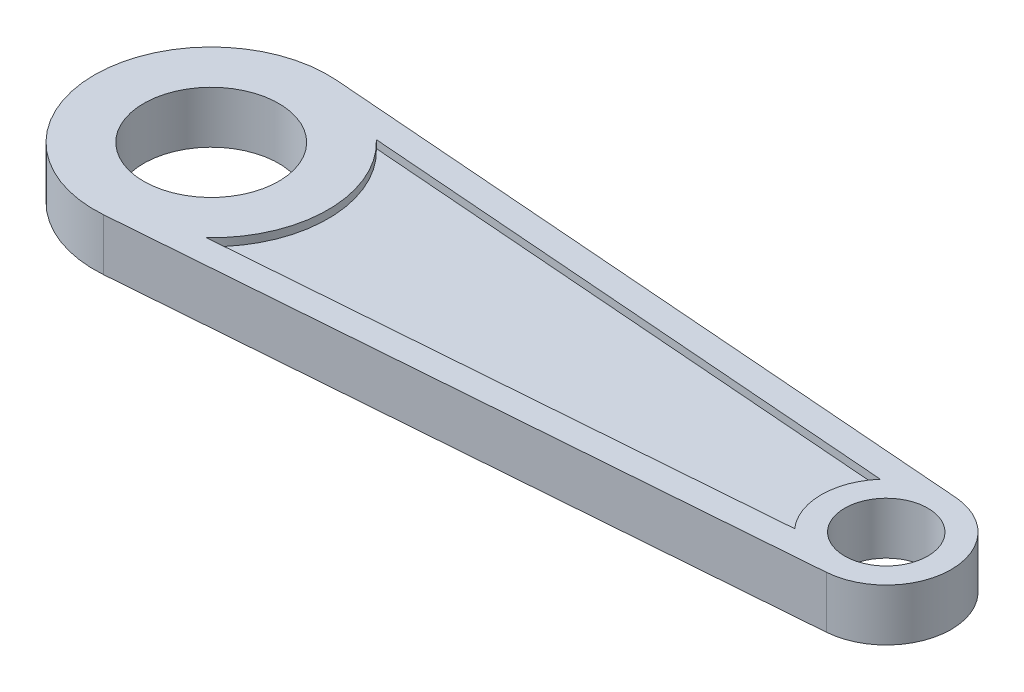
ISO-10303-21;
HEADER;
FILE_DESCRIPTION(('STEP AP214'),'2;1');
FILE_NAME('part.step','',(''),(''),'','','');
FILE_SCHEMA(('AUTOMOTIVE_DESIGN { 1 0 10303 214 1 1 1 1 }'));
ENDSEC;
DATA;
#1=APPLICATION_CONTEXT('core data for automotive mechanical design processes');
#2=APPLICATION_PROTOCOL_DEFINITION('international standard','automotive_design',2000,#1);
#3=PRODUCT_CONTEXT('',#1,'mechanical');
#4=PRODUCT('Part','Part','',(#3));
#5=PRODUCT_RELATED_PRODUCT_CATEGORY('part','',(#4));
#6=PRODUCT_DEFINITION_FORMATION('','',#4);
#7=PRODUCT_DEFINITION_CONTEXT('part definition',#1,'design');
#8=PRODUCT_DEFINITION('design','',#6,#7);
#9=PRODUCT_DEFINITION_SHAPE('','',#8);
#10=(LENGTH_UNIT() NAMED_UNIT(*) SI_UNIT(.MILLI.,.METRE.));
#11=(NAMED_UNIT(*) PLANE_ANGLE_UNIT() SI_UNIT($,.RADIAN.));
#12=(NAMED_UNIT(*) SI_UNIT($,.STERADIAN.) SOLID_ANGLE_UNIT());
#13=UNCERTAINTY_MEASURE_WITH_UNIT(LENGTH_MEASURE(1.E-05),#10,'distance_accuracy_value','');
#14=(GEOMETRIC_REPRESENTATION_CONTEXT(3) GLOBAL_UNCERTAINTY_ASSIGNED_CONTEXT((#13)) GLOBAL_UNIT_ASSIGNED_CONTEXT((#10,
#11,#12)) REPRESENTATION_CONTEXT('',''));
#15=CARTESIAN_POINT('',(0.,0.,0.));
#16=DIRECTION('',(0.,0.,1.));
#17=DIRECTION('',(1.,0.,0.));
#18=AXIS2_PLACEMENT_3D('',#15,#16,#17);
#19=CARTESIAN_POINT('',(130.,10.,0.));
#20=DIRECTION('',(0.,-1.,0.));
#21=DIRECTION('',(0.,0.,-1.));
#22=AXIS2_PLACEMENT_3D('',#19,#20,#21);
#23=CYLINDRICAL_SURFACE('',#22,12.5);
#24=CARTESIAN_POINT('',(130.,0.,0.));
#25=DIRECTION('',(0.,1.,0.));
#26=DIRECTION('',(0.,0.,1.));
#27=AXIS2_PLACEMENT_3D('',#24,#25,#26);
#28=CIRCLE('',#27,12.5);
#29=CARTESIAN_POINT('',(130.961538461538,0.,12.4629628815536));
#30=VERTEX_POINT('',#29);
#31=CARTESIAN_POINT('',(130.961538461538,0.,-12.4629628815536));
#32=VERTEX_POINT('',#31);
#33=EDGE_CURVE('E211',#30,#32,#28,.T.);
#34=ORIENTED_EDGE('',*,*,#33,.T.);
#35=DIRECTION('',(0.,-1.,0.));
#36=VECTOR('',#35,1.);
#37=CARTESIAN_POINT('',(130.961538461538,10.,-12.4629628815536));
#38=LINE('',#37,#36);
#39=CARTESIAN_POINT('',(130.961538461538,10.,-12.4629628815536));
#40=VERTEX_POINT('',#39);
#41=EDGE_CURVE('E11',#40,#32,#38,.T.);
#42=ORIENTED_EDGE('',*,*,#41,.F.);
#43=CARTESIAN_POINT('',(130.,10.,0.));
#44=DIRECTION('',(0.,1.,0.));
#45=DIRECTION('',(0.,0.,1.));
#46=AXIS2_PLACEMENT_3D('',#43,#44,#45);
#47=CIRCLE('',#46,12.5);
#48=CARTESIAN_POINT('',(130.961538461538,10.,12.4629628815536));
#49=VERTEX_POINT('',#48);
#50=EDGE_CURVE('E220',#49,#40,#47,.T.);
#51=ORIENTED_EDGE('',*,*,#50,.F.);
#52=DIRECTION('',(0.,-1.,0.));
#53=VECTOR('',#52,1.);
#54=CARTESIAN_POINT('',(130.961538461538,10.,12.4629628815536));
#55=LINE('',#54,#53);
#56=EDGE_CURVE('E242',#49,#30,#55,.T.);
#57=ORIENTED_EDGE('',*,*,#56,.T.);
#58=EDGE_LOOP('',(#34,#42,#51,#57));
#59=FACE_BOUND('',#58,.T.);
#60=ADVANCED_FACE('F39',(#59),#23,.T.);
#61=CARTESIAN_POINT('',(1.73076923076923,10.,-22.4333331867964));
#62=DIRECTION('',(0.076923076923077,0.,-0.997037030524286));
#63=DIRECTION('',(-0.997037030524286,0.,-0.076923076923077));
#64=AXIS2_PLACEMENT_3D('',#61,#62,#63);
#65=PLANE('',#64);
#66=DIRECTION('',(0.997037030524286,0.,0.076923076923077));
#67=VECTOR('',#66,1.);
#68=CARTESIAN_POINT('',(1.73076923076923,0.,-22.4333331867964));
#69=LINE('',#68,#67);
#70=CARTESIAN_POINT('',(1.73076923076923,0.,-22.4333331867964));
#71=VERTEX_POINT('',#70);
#72=EDGE_CURVE('E246',#71,#32,#69,.T.);
#73=ORIENTED_EDGE('',*,*,#72,.F.);
#74=DIRECTION('',(0.,-1.,0.));
#75=VECTOR('',#74,1.);
#76=CARTESIAN_POINT('',(1.73076923076923,10.,-22.4333331867964));
#77=LINE('',#76,#75);
#78=CARTESIAN_POINT('',(1.73076923076923,10.,-22.4333331867964));
#79=VERTEX_POINT('',#78);
#80=EDGE_CURVE('E47',#79,#71,#77,.T.);
#81=ORIENTED_EDGE('',*,*,#80,.F.);
#82=DIRECTION('',(0.997037030524286,0.,0.076923076923077));
#83=VECTOR('',#82,1.);
#84=CARTESIAN_POINT('',(1.73076923076923,10.,-22.4333331867964));
#85=LINE('',#84,#83);
#86=EDGE_CURVE('E223',#79,#40,#85,.T.);
#87=ORIENTED_EDGE('',*,*,#86,.T.);
#88=ORIENTED_EDGE('',*,*,#41,.T.);
#89=EDGE_LOOP('',(#73,#81,#87,#88));
#90=FACE_BOUND('',#89,.T.);
#91=ADVANCED_FACE('F283',(#90),#65,.T.);
#92=CARTESIAN_POINT('',(0.,10.,0.));
#93=DIRECTION('',(0.,-1.,0.));
#94=DIRECTION('',(0.,0.,-1.));
#95=AXIS2_PLACEMENT_3D('',#92,#93,#94);
#96=CYLINDRICAL_SURFACE('',#95,22.5);
#97=CARTESIAN_POINT('',(0.,0.,0.));
#98=DIRECTION('',(0.,1.,0.));
#99=DIRECTION('',(0.,0.,1.));
#100=AXIS2_PLACEMENT_3D('',#97,#98,#99);
#101=CIRCLE('',#100,22.5);
#102=CARTESIAN_POINT('',(1.73076923076923,0.,22.4333331867964));
#103=VERTEX_POINT('',#102);
#104=EDGE_CURVE('E250',#71,#103,#101,.T.);
#105=ORIENTED_EDGE('',*,*,#104,.T.);
#106=DIRECTION('',(0.,-1.,0.));
#107=VECTOR('',#106,1.);
#108=CARTESIAN_POINT('',(1.73076923076923,10.,22.4333331867964));
#109=LINE('',#108,#107);
#110=CARTESIAN_POINT('',(1.73076923076923,10.,22.4333331867964));
#111=VERTEX_POINT('',#110);
#112=EDGE_CURVE('E266',#111,#103,#109,.T.);
#113=ORIENTED_EDGE('',*,*,#112,.F.);
#114=CARTESIAN_POINT('',(0.,10.,0.));
#115=DIRECTION('',(0.,1.,0.));
#116=DIRECTION('',(0.,0.,1.));
#117=AXIS2_PLACEMENT_3D('',#114,#115,#116);
#118=CIRCLE('',#117,22.5);
#119=EDGE_CURVE('E228',#79,#111,#118,.T.);
#120=ORIENTED_EDGE('',*,*,#119,.F.);
#121=ORIENTED_EDGE('',*,*,#80,.T.);
#122=EDGE_LOOP('',(#105,#113,#120,#121));
#123=FACE_BOUND('',#122,.T.);
#124=ADVANCED_FACE('F273',(#123),#96,.T.);
#125=CARTESIAN_POINT('',(0.,10.,0.));
#126=DIRECTION('',(0.,-1.,0.));
#127=DIRECTION('',(0.,0.,-1.));
#128=AXIS2_PLACEMENT_3D('',#125,#126,#127);
#129=CYLINDRICAL_SURFACE('',#128,13.);
#130=CARTESIAN_POINT('',(0.,10.,0.));
#131=DIRECTION('',(0.,1.,0.));
#132=DIRECTION('',(0.,0.,1.));
#133=AXIS2_PLACEMENT_3D('',#130,#131,#132);
#134=CIRCLE('',#133,13.);
#135=CARTESIAN_POINT('',(0.,10.,13.));
#136=VERTEX_POINT('',#135);
#137=EDGE_CURVE('E234',#136,#136,#134,.T.);
#138=ORIENTED_EDGE('',*,*,#137,.T.);
#139=EDGE_LOOP('',(#138));
#140=FACE_BOUND('',#139,.T.);
#141=CARTESIAN_POINT('',(0.,0.,0.));
#142=DIRECTION('',(0.,1.,0.));
#143=DIRECTION('',(0.,0.,1.));
#144=AXIS2_PLACEMENT_3D('',#141,#142,#143);
#145=CIRCLE('',#144,13.);
#146=CARTESIAN_POINT('',(0.,0.,13.));
#147=VERTEX_POINT('',#146);
#148=EDGE_CURVE('E256',#147,#147,#145,.T.);
#149=ORIENTED_EDGE('',*,*,#148,.F.);
#150=EDGE_LOOP('',(#149));
#151=FACE_BOUND('',#150,.T.);
#152=ADVANCED_FACE('F323',(#140,#151),#129,.F.);
#153=CARTESIAN_POINT('',(1.73076923076923,10.,22.4333331867964));
#154=DIRECTION('',(-0.076923076923077,0.,-0.997037030524286));
#155=DIRECTION('',(-0.997037030524286,0.,0.076923076923077));
#156=AXIS2_PLACEMENT_3D('',#153,#154,#155);
#157=PLANE('',#156);
#158=DIRECTION('',(0.997037030524286,0.,-0.076923076923077));
#159=VECTOR('',#158,1.);
#160=CARTESIAN_POINT('',(1.73076923076923,0.,22.4333331867964));
#161=LINE('',#160,#159);
#162=EDGE_CURVE('E253',#103,#30,#161,.T.);
#163=ORIENTED_EDGE('',*,*,#162,.T.);
#164=ORIENTED_EDGE('',*,*,#56,.F.);
#165=DIRECTION('',(0.997037030524286,0.,-0.076923076923077));
#166=VECTOR('',#165,1.);
#167=CARTESIAN_POINT('',(1.73076923076923,10.,22.4333331867964));
#168=LINE('',#167,#166);
#169=EDGE_CURVE('E231',#111,#49,#168,.T.);
#170=ORIENTED_EDGE('',*,*,#169,.F.);
#171=ORIENTED_EDGE('',*,*,#112,.T.);
#172=EDGE_LOOP('',(#163,#164,#170,#171));
#173=FACE_BOUND('',#172,.T.);
#174=ADVANCED_FACE('F290',(#173),#157,.F.);
#175=CARTESIAN_POINT('',(130.,10.,0.));
#176=DIRECTION('',(0.,-1.,0.));
#177=DIRECTION('',(0.,0.,-1.));
#178=AXIS2_PLACEMENT_3D('',#175,#176,#177);
#179=CYLINDRICAL_SURFACE('',#178,8.00000000000001);
#180=CARTESIAN_POINT('',(130.,10.,0.));
#181=DIRECTION('',(0.,1.,0.));
#182=DIRECTION('',(0.,0.,1.));
#183=AXIS2_PLACEMENT_3D('',#180,#181,#182);
#184=CIRCLE('',#183,8.00000000000001);
#185=CARTESIAN_POINT('',(130.,10.,8.00000000000001));
#186=VERTEX_POINT('',#185);
#187=EDGE_CURVE('E238',#186,#186,#184,.T.);
#188=ORIENTED_EDGE('',*,*,#187,.T.);
#189=EDGE_LOOP('',(#188));
#190=FACE_BOUND('',#189,.T.);
#191=CARTESIAN_POINT('',(130.,0.,0.));
#192=DIRECTION('',(0.,1.,0.));
#193=DIRECTION('',(0.,0.,1.));
#194=AXIS2_PLACEMENT_3D('',#191,#192,#193);
#195=CIRCLE('',#194,8.00000000000001);
#196=CARTESIAN_POINT('',(130.,0.,8.00000000000001));
#197=VERTEX_POINT('',#196);
#198=EDGE_CURVE('E224',#197,#197,#195,.T.);
#199=ORIENTED_EDGE('',*,*,#198,.F.);
#200=EDGE_LOOP('',(#199));
#201=FACE_BOUND('',#200,.T.);
#202=ADVANCED_FACE('F295',(#190,#201),#179,.F.);
#203=CARTESIAN_POINT('',(0.,10.,0.));
#204=DIRECTION('',(0.,1.,0.));
#205=DIRECTION('',(0.,0.,1.));
#206=AXIS2_PLACEMENT_3D('',#203,#204,#205);
#207=PLANE('',#206);
#208=CARTESIAN_POINT('',(0.,10.,0.));
#209=DIRECTION('',(0.,-1.,0.));
#210=DIRECTION('',(0.,0.,1.));
#211=AXIS2_PLACEMENT_3D('',#208,#209,#210);
#212=CIRCLE('',#211,22.5);
#213=CARTESIAN_POINT('',(15.4463867537103,10.,-16.3602914477342));
#214=VERTEX_POINT('',#213);
#215=CARTESIAN_POINT('',(15.4463867537103,10.,16.3602914477342));
#216=VERTEX_POINT('',#215);
#217=EDGE_CURVE('E62',#214,#216,#212,.T.);
#218=ORIENTED_EDGE('',*,*,#217,.F.);
#219=DIRECTION('',(-0.997037030524286,0.,-0.0769230769230769));
#220=VECTOR('',#219,1.);
#221=CARTESIAN_POINT('',(15.4463867537103,10.,-16.3602914477342));
#222=LINE('',#221,#220);
#223=CARTESIAN_POINT('',(120.60655277168,10.,-8.24700849816292));
#224=VERTEX_POINT('',#223);
#225=EDGE_CURVE('E182',#224,#214,#222,.T.);
#226=ORIENTED_EDGE('',*,*,#225,.F.);
#227=CARTESIAN_POINT('',(130.,10.,0.));
#228=DIRECTION('',(0.,-1.,0.));
#229=DIRECTION('',(0.,0.,1.));
#230=AXIS2_PLACEMENT_3D('',#227,#228,#229);
#231=CIRCLE('',#230,12.5);
#232=CARTESIAN_POINT('',(120.60655277168,10.,8.24700849816291));
#233=VERTEX_POINT('',#232);
#234=EDGE_CURVE('E201',#233,#224,#231,.T.);
#235=ORIENTED_EDGE('',*,*,#234,.F.);
#236=DIRECTION('',(0.997037030524286,0.,-0.0769230769230769));
#237=VECTOR('',#236,1.);
#238=CARTESIAN_POINT('',(15.4463867537103,10.,16.3602914477342));
#239=LINE('',#238,#237);
#240=EDGE_CURVE('E197',#216,#233,#239,.T.);
#241=ORIENTED_EDGE('',*,*,#240,.F.);
#242=EDGE_LOOP('',(#218,#226,#235,#241));
#243=FACE_BOUND('',#242,.T.);
#244=ORIENTED_EDGE('',*,*,#50,.T.);
#245=ORIENTED_EDGE('',*,*,#86,.F.);
#246=ORIENTED_EDGE('',*,*,#119,.T.);
#247=ORIENTED_EDGE('',*,*,#169,.T.);
#248=EDGE_LOOP('',(#244,#245,#246,#247));
#249=FACE_BOUND('',#248,.T.);
#250=ORIENTED_EDGE('',*,*,#137,.F.);
#251=EDGE_LOOP('',(#250));
#252=FACE_BOUND('',#251,.T.);
#253=ORIENTED_EDGE('',*,*,#187,.F.);
#254=EDGE_LOOP('',(#253));
#255=FACE_BOUND('',#254,.T.);
#256=ADVANCED_FACE('F292',(#243,#249,#252,#255),#207,.T.);
#257=CARTESIAN_POINT('',(0.,0.,0.));
#258=DIRECTION('',(0.,1.,0.));
#259=DIRECTION('',(0.,0.,1.));
#260=AXIS2_PLACEMENT_3D('',#257,#258,#259);
#261=PLANE('',#260);
#262=DIRECTION('',(0.997037030524286,0.,0.0769230769230769));
#263=VECTOR('',#262,1.);
#264=CARTESIAN_POINT('',(15.4463867537103,0.,-16.3602914477342));
#265=LINE('',#264,#263);
#266=CARTESIAN_POINT('',(15.4463867537103,0.,-16.3602914477342));
#267=VERTEX_POINT('',#266);
#268=CARTESIAN_POINT('',(120.60655277168,0.,-8.24700849816291));
#269=VERTEX_POINT('',#268);
#270=EDGE_CURVE('E163',#267,#269,#265,.T.);
#271=ORIENTED_EDGE('',*,*,#270,.F.);
#272=CARTESIAN_POINT('',(0.,0.,0.));
#273=DIRECTION('',(0.,1.,0.));
#274=DIRECTION('',(0.,0.,-1.));
#275=AXIS2_PLACEMENT_3D('',#272,#273,#274);
#276=CIRCLE('',#275,22.5);
#277=CARTESIAN_POINT('',(15.4463867537103,0.,16.3602914477342));
#278=VERTEX_POINT('',#277);
#279=EDGE_CURVE('E54',#278,#267,#276,.T.);
#280=ORIENTED_EDGE('',*,*,#279,.F.);
#281=DIRECTION('',(-0.997037030524286,0.,0.0769230769230769));
#282=VECTOR('',#281,1.);
#283=CARTESIAN_POINT('',(15.4463867537103,0.,16.3602914477342));
#284=LINE('',#283,#282);
#285=CARTESIAN_POINT('',(120.60655277168,0.,8.24700849816292));
#286=VERTEX_POINT('',#285);
#287=EDGE_CURVE('E150',#286,#278,#284,.T.);
#288=ORIENTED_EDGE('',*,*,#287,.F.);
#289=CARTESIAN_POINT('',(130.,0.,0.));
#290=DIRECTION('',(0.,1.,0.));
#291=DIRECTION('',(0.,0.,-1.));
#292=AXIS2_PLACEMENT_3D('',#289,#290,#291);
#293=CIRCLE('',#292,12.5);
#294=EDGE_CURVE('E154',#269,#286,#293,.T.);
#295=ORIENTED_EDGE('',*,*,#294,.F.);
#296=EDGE_LOOP('',(#271,#280,#288,#295));
#297=FACE_BOUND('',#296,.T.);
#298=ORIENTED_EDGE('',*,*,#33,.F.);
#299=ORIENTED_EDGE('',*,*,#162,.F.);
#300=ORIENTED_EDGE('',*,*,#104,.F.);
#301=ORIENTED_EDGE('',*,*,#72,.T.);
#302=EDGE_LOOP('',(#298,#299,#300,#301));
#303=FACE_BOUND('',#302,.T.);
#304=ORIENTED_EDGE('',*,*,#148,.T.);
#305=EDGE_LOOP('',(#304));
#306=FACE_BOUND('',#305,.T.);
#307=ORIENTED_EDGE('',*,*,#198,.T.);
#308=EDGE_LOOP('',(#307));
#309=FACE_BOUND('',#308,.T.);
#310=ADVANCED_FACE('F281',(#297,#303,#306,#309),#261,.F.);
#311=CARTESIAN_POINT('',(0.,8.5,0.));
#312=DIRECTION('',(0.,1.,0.));
#313=DIRECTION('',(0.,0.,1.));
#314=AXIS2_PLACEMENT_3D('',#311,#312,#313);
#315=CYLINDRICAL_SURFACE('',#314,22.5);
#316=ORIENTED_EDGE('',*,*,#217,.T.);
#317=DIRECTION('',(0.,1.,0.));
#318=VECTOR('',#317,1.);
#319=CARTESIAN_POINT('',(15.4463867537103,8.5,16.3602914477342));
#320=LINE('',#319,#318);
#321=CARTESIAN_POINT('',(15.4463867537103,8.5,16.3602914477342));
#322=VERTEX_POINT('',#321);
#323=EDGE_CURVE('E194',#322,#216,#320,.T.);
#324=ORIENTED_EDGE('',*,*,#323,.F.);
#325=CARTESIAN_POINT('',(0.,8.5,0.));
#326=DIRECTION('',(0.,-1.,0.));
#327=DIRECTION('',(0.,0.,1.));
#328=AXIS2_PLACEMENT_3D('',#325,#326,#327);
#329=CIRCLE('',#328,22.5);
#330=CARTESIAN_POINT('',(15.4463867537103,8.5,-16.3602914477342));
#331=VERTEX_POINT('',#330);
#332=EDGE_CURVE('E177',#331,#322,#329,.T.);
#333=ORIENTED_EDGE('',*,*,#332,.F.);
#334=DIRECTION('',(0.,1.,0.));
#335=VECTOR('',#334,1.);
#336=CARTESIAN_POINT('',(15.4463867537103,8.5,-16.3602914477342));
#337=LINE('',#336,#335);
#338=EDGE_CURVE('E208',#331,#214,#337,.T.);
#339=ORIENTED_EDGE('',*,*,#338,.T.);
#340=EDGE_LOOP('',(#316,#324,#333,#339));
#341=FACE_BOUND('',#340,.T.);
#342=ADVANCED_FACE('F308',(#341),#315,.T.);
#343=CARTESIAN_POINT('',(15.4463867537103,8.5,-16.3602914477342));
#344=DIRECTION('',(0.0769230769230769,0.,-0.997037030524286));
#345=DIRECTION('',(-0.997037030524286,0.,-0.0769230769230769));
#346=AXIS2_PLACEMENT_3D('',#343,#344,#345);
#347=PLANE('',#346);
#348=ORIENTED_EDGE('',*,*,#225,.T.);
#349=ORIENTED_EDGE('',*,*,#338,.F.);
#350=DIRECTION('',(-0.997037030524286,0.,-0.0769230769230769));
#351=VECTOR('',#350,1.);
#352=CARTESIAN_POINT('',(15.4463867537103,8.5,-16.3602914477342));
#353=LINE('',#352,#351);
#354=CARTESIAN_POINT('',(120.60655277168,8.5,-8.24700849816292));
#355=VERTEX_POINT('',#354);
#356=EDGE_CURVE('E190',#355,#331,#353,.T.);
#357=ORIENTED_EDGE('',*,*,#356,.F.);
#358=DIRECTION('',(0.,1.,0.));
#359=VECTOR('',#358,1.);
#360=CARTESIAN_POINT('',(120.60655277168,8.5,-8.24700849816292));
#361=LINE('',#360,#359);
#362=EDGE_CURVE('E212',#355,#224,#361,.T.);
#363=ORIENTED_EDGE('',*,*,#362,.T.);
#364=EDGE_LOOP('',(#348,#349,#357,#363));
#365=FACE_BOUND('',#364,.T.);
#366=ADVANCED_FACE('F314',(#365),#347,.F.);
#367=CARTESIAN_POINT('',(130.,8.5,0.));
#368=DIRECTION('',(0.,1.,0.));
#369=DIRECTION('',(0.,0.,1.));
#370=AXIS2_PLACEMENT_3D('',#367,#368,#369);
#371=CYLINDRICAL_SURFACE('',#370,12.5);
#372=ORIENTED_EDGE('',*,*,#234,.T.);
#373=ORIENTED_EDGE('',*,*,#362,.F.);
#374=CARTESIAN_POINT('',(130.,8.5,0.));
#375=DIRECTION('',(0.,-1.,0.));
#376=DIRECTION('',(0.,0.,1.));
#377=AXIS2_PLACEMENT_3D('',#374,#375,#376);
#378=CIRCLE('',#377,12.5);
#379=CARTESIAN_POINT('',(120.60655277168,8.5,8.24700849816291));
#380=VERTEX_POINT('',#379);
#381=EDGE_CURVE('E186',#380,#355,#378,.T.);
#382=ORIENTED_EDGE('',*,*,#381,.F.);
#383=DIRECTION('',(0.,1.,0.));
#384=VECTOR('',#383,1.);
#385=CARTESIAN_POINT('',(120.60655277168,8.5,8.24700849816291));
#386=LINE('',#385,#384);
#387=EDGE_CURVE('E215',#380,#233,#386,.T.);
#388=ORIENTED_EDGE('',*,*,#387,.T.);
#389=EDGE_LOOP('',(#372,#373,#382,#388));
#390=FACE_BOUND('',#389,.T.);
#391=ADVANCED_FACE('F366',(#390),#371,.T.);
#392=CARTESIAN_POINT('',(15.4463867537103,8.5,16.3602914477342));
#393=DIRECTION('',(0.0769230769230769,0.,0.997037030524286));
#394=DIRECTION('',(0.997037030524286,0.,-0.0769230769230769));
#395=AXIS2_PLACEMENT_3D('',#392,#393,#394);
#396=PLANE('',#395);
#397=ORIENTED_EDGE('',*,*,#240,.T.);
#398=ORIENTED_EDGE('',*,*,#387,.F.);
#399=DIRECTION('',(0.997037030524286,0.,-0.0769230769230769));
#400=VECTOR('',#399,1.);
#401=CARTESIAN_POINT('',(15.4463867537103,8.5,16.3602914477342));
#402=LINE('',#401,#400);
#403=EDGE_CURVE('E181',#322,#380,#402,.T.);
#404=ORIENTED_EDGE('',*,*,#403,.F.);
#405=ORIENTED_EDGE('',*,*,#323,.T.);
#406=EDGE_LOOP('',(#397,#398,#404,#405));
#407=FACE_BOUND('',#406,.T.);
#408=ADVANCED_FACE('F376',(#407),#396,.F.);
#409=CARTESIAN_POINT('',(0.,8.5,0.));
#410=DIRECTION('',(0.,1.,0.));
#411=DIRECTION('',(0.,0.,1.));
#412=AXIS2_PLACEMENT_3D('',#409,#410,#411);
#413=PLANE('',#412);
#414=ORIENTED_EDGE('',*,*,#332,.T.);
#415=ORIENTED_EDGE('',*,*,#403,.T.);
#416=ORIENTED_EDGE('',*,*,#381,.T.);
#417=ORIENTED_EDGE('',*,*,#356,.T.);
#418=EDGE_LOOP('',(#414,#415,#416,#417));
#419=FACE_BOUND('',#418,.T.);
#420=ADVANCED_FACE('F386',(#419),#413,.T.);
#421=CARTESIAN_POINT('',(0.,1.5,0.));
#422=DIRECTION('',(0.,-1.,0.));
#423=DIRECTION('',(0.,0.,-1.));
#424=AXIS2_PLACEMENT_3D('',#421,#422,#423);
#425=CYLINDRICAL_SURFACE('',#424,22.5);
#426=ORIENTED_EDGE('',*,*,#279,.T.);
#427=DIRECTION('',(0.,-1.,0.));
#428=VECTOR('',#427,1.);
#429=CARTESIAN_POINT('',(15.4463867537103,1.5,-16.3602914477342));
#430=LINE('',#429,#428);
#431=CARTESIAN_POINT('',(15.4463867537103,1.5,-16.3602914477342));
#432=VERTEX_POINT('',#431);
#433=EDGE_CURVE('E125',#432,#267,#430,.T.);
#434=ORIENTED_EDGE('',*,*,#433,.F.);
#435=CARTESIAN_POINT('',(0.,1.5,0.));
#436=DIRECTION('',(0.,1.,0.));
#437=DIRECTION('',(0.,0.,-1.));
#438=AXIS2_PLACEMENT_3D('',#435,#436,#437);
#439=CIRCLE('',#438,22.5);
#440=CARTESIAN_POINT('',(15.4463867537103,1.5,16.3602914477342));
#441=VERTEX_POINT('',#440);
#442=EDGE_CURVE('E129',#441,#432,#439,.T.);
#443=ORIENTED_EDGE('',*,*,#442,.F.);
#444=DIRECTION('',(0.,-1.,0.));
#445=VECTOR('',#444,1.);
#446=CARTESIAN_POINT('',(15.4463867537103,1.5,16.3602914477342));
#447=LINE('',#446,#445);
#448=EDGE_CURVE('E169',#441,#278,#447,.T.);
#449=ORIENTED_EDGE('',*,*,#448,.T.);
#450=EDGE_LOOP('',(#426,#434,#443,#449));
#451=FACE_BOUND('',#450,.T.);
#452=ADVANCED_FACE('F127',(#451),#425,.T.);
#453=CARTESIAN_POINT('',(15.4463867537103,1.5,16.3602914477342));
#454=DIRECTION('',(0.0769230769230769,0.,0.997037030524286));
#455=DIRECTION('',(0.997037030524286,0.,-0.0769230769230769));
#456=AXIS2_PLACEMENT_3D('',#453,#454,#455);
#457=PLANE('',#456);
#458=ORIENTED_EDGE('',*,*,#287,.T.);
#459=ORIENTED_EDGE('',*,*,#448,.F.);
#460=DIRECTION('',(-0.997037030524286,0.,0.0769230769230769));
#461=VECTOR('',#460,1.);
#462=CARTESIAN_POINT('',(15.4463867537103,1.5,16.3602914477342));
#463=LINE('',#462,#461);
#464=CARTESIAN_POINT('',(120.60655277168,1.5,8.24700849816292));
#465=VERTEX_POINT('',#464);
#466=EDGE_CURVE('E136',#465,#441,#463,.T.);
#467=ORIENTED_EDGE('',*,*,#466,.F.);
#468=DIRECTION('',(0.,-1.,0.));
#469=VECTOR('',#468,1.);
#470=CARTESIAN_POINT('',(120.60655277168,1.5,8.24700849816292));
#471=LINE('',#470,#469);
#472=EDGE_CURVE('E172',#465,#286,#471,.T.);
#473=ORIENTED_EDGE('',*,*,#472,.T.);
#474=EDGE_LOOP('',(#458,#459,#467,#473));
#475=FACE_BOUND('',#474,.T.);
#476=ADVANCED_FACE('F409',(#475),#457,.F.);
#477=CARTESIAN_POINT('',(130.,1.5,0.));
#478=DIRECTION('',(0.,-1.,0.));
#479=DIRECTION('',(0.,0.,-1.));
#480=AXIS2_PLACEMENT_3D('',#477,#478,#479);
#481=CYLINDRICAL_SURFACE('',#480,12.5);
#482=ORIENTED_EDGE('',*,*,#294,.T.);
#483=ORIENTED_EDGE('',*,*,#472,.F.);
#484=CARTESIAN_POINT('',(130.,1.5,0.));
#485=DIRECTION('',(0.,1.,0.));
#486=DIRECTION('',(0.,0.,-1.));
#487=AXIS2_PLACEMENT_3D('',#484,#485,#486);
#488=CIRCLE('',#487,12.5);
#489=CARTESIAN_POINT('',(120.60655277168,1.5,-8.24700849816291));
#490=VERTEX_POINT('',#489);
#491=EDGE_CURVE('E145',#490,#465,#488,.T.);
#492=ORIENTED_EDGE('',*,*,#491,.F.);
#493=DIRECTION('',(0.,-1.,0.));
#494=VECTOR('',#493,1.);
#495=CARTESIAN_POINT('',(120.60655277168,1.5,-8.24700849816291));
#496=LINE('',#495,#494);
#497=EDGE_CURVE('E135',#490,#269,#496,.T.);
#498=ORIENTED_EDGE('',*,*,#497,.T.);
#499=EDGE_LOOP('',(#482,#483,#492,#498));
#500=FACE_BOUND('',#499,.T.);
#501=ADVANCED_FACE('F418',(#500),#481,.T.);
#502=CARTESIAN_POINT('',(15.4463867537103,1.5,-16.3602914477342));
#503=DIRECTION('',(0.0769230769230769,0.,-0.997037030524286));
#504=DIRECTION('',(-0.997037030524286,0.,-0.0769230769230769));
#505=AXIS2_PLACEMENT_3D('',#502,#503,#504);
#506=PLANE('',#505);
#507=ORIENTED_EDGE('',*,*,#270,.T.);
#508=ORIENTED_EDGE('',*,*,#497,.F.);
#509=DIRECTION('',(0.997037030524286,0.,0.0769230769230769));
#510=VECTOR('',#509,1.);
#511=CARTESIAN_POINT('',(15.4463867537103,1.5,-16.3602914477342));
#512=LINE('',#511,#510);
#513=EDGE_CURVE('E139',#432,#490,#512,.T.);
#514=ORIENTED_EDGE('',*,*,#513,.F.);
#515=ORIENTED_EDGE('',*,*,#433,.T.);
#516=EDGE_LOOP('',(#507,#508,#514,#515));
#517=FACE_BOUND('',#516,.T.);
#518=ADVANCED_FACE('F140',(#517),#506,.F.);
#519=CARTESIAN_POINT('',(0.,1.5,0.));
#520=DIRECTION('',(0.,-1.,0.));
#521=DIRECTION('',(0.,0.,-1.));
#522=AXIS2_PLACEMENT_3D('',#519,#520,#521);
#523=PLANE('',#522);
#524=ORIENTED_EDGE('',*,*,#442,.T.);
#525=ORIENTED_EDGE('',*,*,#513,.T.);
#526=ORIENTED_EDGE('',*,*,#491,.T.);
#527=ORIENTED_EDGE('',*,*,#466,.T.);
#528=EDGE_LOOP('',(#524,#525,#526,#527));
#529=FACE_BOUND('',#528,.T.);
#530=ADVANCED_FACE('F147',(#529),#523,.T.);
#531=CLOSED_SHELL('',(#60,#91,#124,#152,#174,#202,#256,#310,#342,#366,#391,#408,#420,#452,#476,
#501,#518,#530));
#532=MANIFOLD_SOLID_BREP('B2',#531);
#533=ADVANCED_BREP_SHAPE_REPRESENTATION('',(#18,#532),#14);
#534=SHAPE_DEFINITION_REPRESENTATION(#9,#533);
ENDSEC;
END-ISO-10303-21;
